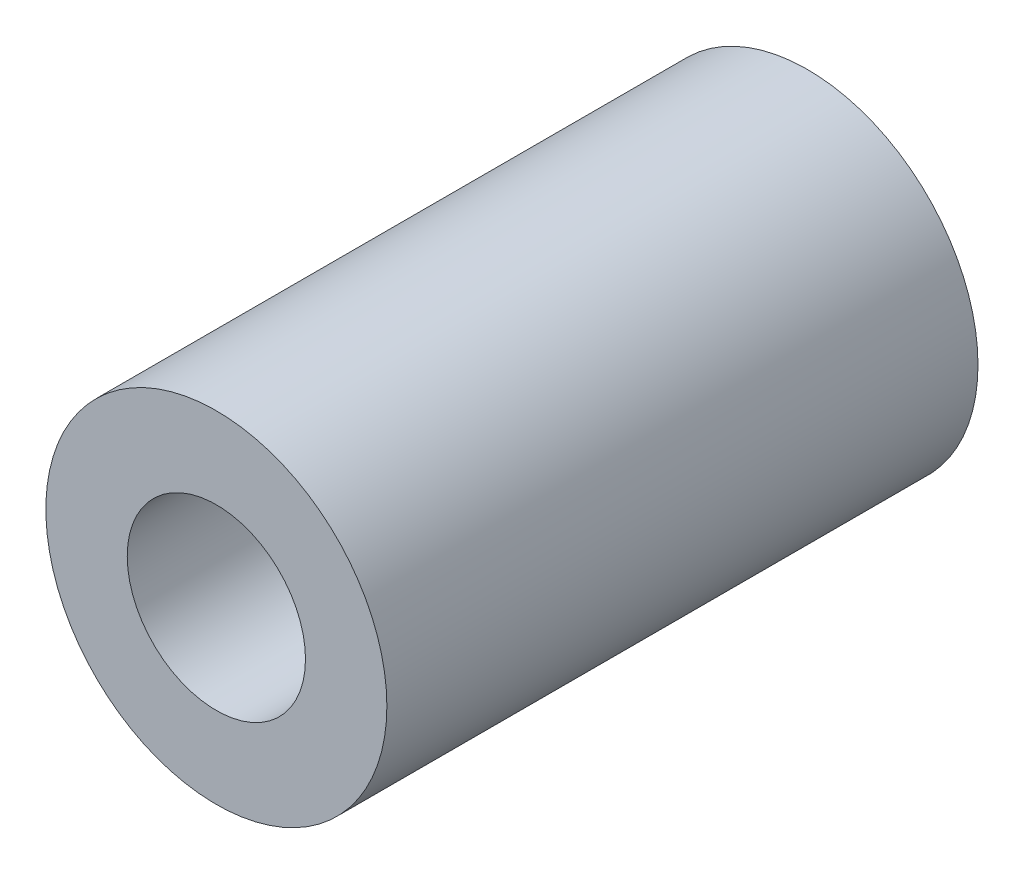
ISO-10303-21;
HEADER;
FILE_DESCRIPTION(('STEP AP214'),'2;1');
FILE_NAME('part.step','',(''),(''),'','','');
FILE_SCHEMA(('AUTOMOTIVE_DESIGN { 1 0 10303 214 1 1 1 1 }'));
ENDSEC;
DATA;
#1=APPLICATION_CONTEXT('core data for automotive mechanical design processes');
#2=APPLICATION_PROTOCOL_DEFINITION('international standard','automotive_design',2000,#1);
#3=PRODUCT_CONTEXT('',#1,'mechanical');
#4=PRODUCT('Part','Part','',(#3));
#5=PRODUCT_RELATED_PRODUCT_CATEGORY('part','',(#4));
#6=PRODUCT_DEFINITION_FORMATION('','',#4);
#7=PRODUCT_DEFINITION_CONTEXT('part definition',#1,'design');
#8=PRODUCT_DEFINITION('design','',#6,#7);
#9=PRODUCT_DEFINITION_SHAPE('','',#8);
#10=(LENGTH_UNIT() NAMED_UNIT(*) SI_UNIT(.MILLI.,.METRE.));
#11=(NAMED_UNIT(*) PLANE_ANGLE_UNIT() SI_UNIT($,.RADIAN.));
#12=(NAMED_UNIT(*) SI_UNIT($,.STERADIAN.) SOLID_ANGLE_UNIT());
#13=UNCERTAINTY_MEASURE_WITH_UNIT(LENGTH_MEASURE(1.E-05),#10,'distance_accuracy_value','');
#14=(GEOMETRIC_REPRESENTATION_CONTEXT(3) GLOBAL_UNCERTAINTY_ASSIGNED_CONTEXT((#13)) GLOBAL_UNIT_ASSIGNED_CONTEXT((#10,
#11,#12)) REPRESENTATION_CONTEXT('',''));
#15=CARTESIAN_POINT('',(0.,0.,0.));
#16=DIRECTION('',(0.,0.,1.));
#17=DIRECTION('',(1.,0.,0.));
#18=AXIS2_PLACEMENT_3D('',#15,#16,#17);
#19=CARTESIAN_POINT('',(0.,0.,16.51));
#20=DIRECTION('',(0.,0.,1.));
#21=DIRECTION('',(1.,0.,0.));
#22=AXIS2_PLACEMENT_3D('',#19,#20,#21);
#23=PLANE('',#22);
#24=CARTESIAN_POINT('',(0.,0.,16.51));
#25=DIRECTION('',(0.,0.,1.));
#26=DIRECTION('',(1.,0.,0.));
#27=AXIS2_PLACEMENT_3D('',#24,#25,#26);
#28=CIRCLE('',#27,4.7625);
#29=CARTESIAN_POINT('',(4.7625,0.,16.51));
#30=VERTEX_POINT('',#29);
#31=EDGE_CURVE('E10',#30,#30,#28,.T.);
#32=ORIENTED_EDGE('',*,*,#31,.T.);
#33=EDGE_LOOP('',(#32));
#34=FACE_BOUND('',#33,.T.);
#35=CARTESIAN_POINT('',(0.,0.,16.51));
#36=DIRECTION('',(0.,0.,1.));
#37=DIRECTION('',(1.,0.,0.));
#38=AXIS2_PLACEMENT_3D('',#35,#36,#37);
#39=CIRCLE('',#38,2.4892);
#40=CARTESIAN_POINT('',(2.4892,0.,16.51));
#41=VERTEX_POINT('',#40);
#42=EDGE_CURVE('E48',#41,#41,#39,.T.);
#43=ORIENTED_EDGE('',*,*,#42,.F.);
#44=EDGE_LOOP('',(#43));
#45=FACE_BOUND('',#44,.T.);
#46=ADVANCED_FACE('F37',(#34,#45),#23,.T.);
#47=CARTESIAN_POINT('',(0.,0.,0.));
#48=DIRECTION('',(0.,0.,1.));
#49=DIRECTION('',(1.,0.,0.));
#50=AXIS2_PLACEMENT_3D('',#47,#48,#49);
#51=PLANE('',#50);
#52=CARTESIAN_POINT('',(0.,0.,0.));
#53=DIRECTION('',(0.,0.,1.));
#54=DIRECTION('',(1.,0.,0.));
#55=AXIS2_PLACEMENT_3D('',#52,#53,#54);
#56=CIRCLE('',#55,4.7625);
#57=CARTESIAN_POINT('',(4.7625,0.,0.));
#58=VERTEX_POINT('',#57);
#59=EDGE_CURVE('E41',#58,#58,#56,.T.);
#60=ORIENTED_EDGE('',*,*,#59,.F.);
#61=EDGE_LOOP('',(#60));
#62=FACE_BOUND('',#61,.T.);
#63=CARTESIAN_POINT('',(0.,0.,0.));
#64=DIRECTION('',(0.,0.,1.));
#65=DIRECTION('',(1.,0.,0.));
#66=AXIS2_PLACEMENT_3D('',#63,#64,#65);
#67=CIRCLE('',#66,2.4892);
#68=CARTESIAN_POINT('',(2.4892,0.,0.));
#69=VERTEX_POINT('',#68);
#70=EDGE_CURVE('E50',#69,#69,#67,.T.);
#71=ORIENTED_EDGE('',*,*,#70,.T.);
#72=EDGE_LOOP('',(#71));
#73=FACE_BOUND('',#72,.T.);
#74=ADVANCED_FACE('F60',(#62,#73),#51,.F.);
#75=CARTESIAN_POINT('',(0.,0.,16.51));
#76=DIRECTION('',(0.,0.,-1.));
#77=DIRECTION('',(-1.,0.,0.));
#78=AXIS2_PLACEMENT_3D('',#75,#76,#77);
#79=CYLINDRICAL_SURFACE('',#78,4.7625);
#80=ORIENTED_EDGE('',*,*,#31,.F.);
#81=EDGE_LOOP('',(#80));
#82=FACE_BOUND('',#81,.T.);
#83=ORIENTED_EDGE('',*,*,#59,.T.);
#84=EDGE_LOOP('',(#83));
#85=FACE_BOUND('',#84,.T.);
#86=ADVANCED_FACE('F39',(#82,#85),#79,.T.);
#87=CARTESIAN_POINT('',(0.,0.,16.51));
#88=DIRECTION('',(0.,0.,-1.));
#89=DIRECTION('',(-1.,0.,0.));
#90=AXIS2_PLACEMENT_3D('',#87,#88,#89);
#91=CYLINDRICAL_SURFACE('',#90,2.4892);
#92=ORIENTED_EDGE('',*,*,#42,.T.);
#93=EDGE_LOOP('',(#92));
#94=FACE_BOUND('',#93,.T.);
#95=ORIENTED_EDGE('',*,*,#70,.F.);
#96=EDGE_LOOP('',(#95));
#97=FACE_BOUND('',#96,.T.);
#98=ADVANCED_FACE('F56',(#94,#97),#91,.F.);
#99=CLOSED_SHELL('',(#46,#74,#86,#98));
#100=MANIFOLD_SOLID_BREP('B2',#99);
#101=ADVANCED_BREP_SHAPE_REPRESENTATION('',(#18,#100),#14);
#102=SHAPE_DEFINITION_REPRESENTATION(#9,#101);
ENDSEC;
END-ISO-10303-21;
